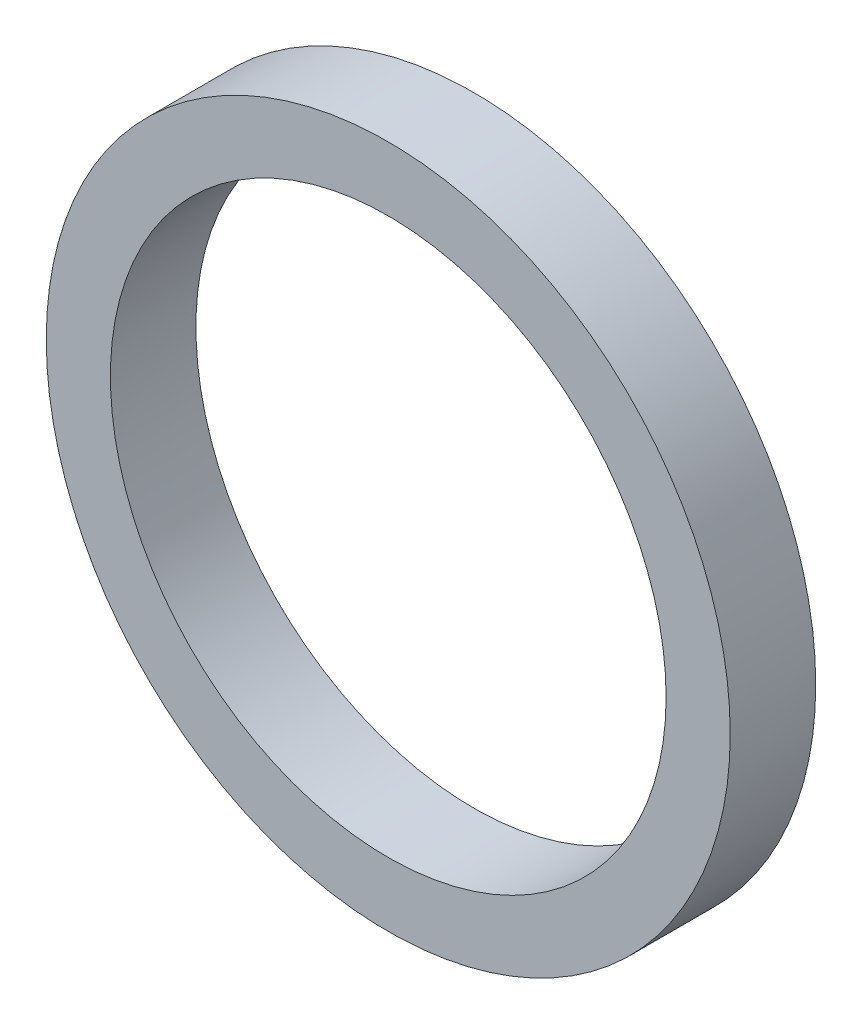
ISO-10303-21;
HEADER;
FILE_DESCRIPTION(('STEP AP214'),'2;1');
FILE_NAME('part.step','',(''),(''),'','','');
FILE_SCHEMA(('AUTOMOTIVE_DESIGN { 1 0 10303 214 1 1 1 1 }'));
ENDSEC;
DATA;
#1=APPLICATION_CONTEXT('core data for automotive mechanical design processes');
#2=APPLICATION_PROTOCOL_DEFINITION('international standard','automotive_design',2000,#1);
#3=PRODUCT_CONTEXT('',#1,'mechanical');
#4=PRODUCT('Part','Part','',(#3));
#5=PRODUCT_RELATED_PRODUCT_CATEGORY('part','',(#4));
#6=PRODUCT_DEFINITION_FORMATION('','',#4);
#7=PRODUCT_DEFINITION_CONTEXT('part definition',#1,'design');
#8=PRODUCT_DEFINITION('design','',#6,#7);
#9=PRODUCT_DEFINITION_SHAPE('','',#8);
#10=(LENGTH_UNIT() NAMED_UNIT(*) SI_UNIT(.MILLI.,.METRE.));
#11=(NAMED_UNIT(*) PLANE_ANGLE_UNIT() SI_UNIT($,.RADIAN.));
#12=(NAMED_UNIT(*) SI_UNIT($,.STERADIAN.) SOLID_ANGLE_UNIT());
#13=UNCERTAINTY_MEASURE_WITH_UNIT(LENGTH_MEASURE(1.E-05),#10,'distance_accuracy_value','');
#14=(GEOMETRIC_REPRESENTATION_CONTEXT(3) GLOBAL_UNCERTAINTY_ASSIGNED_CONTEXT((#13)) GLOBAL_UNIT_ASSIGNED_CONTEXT((#10,
#11,#12)) REPRESENTATION_CONTEXT('',''));
#15=CARTESIAN_POINT('',(0.,0.,0.));
#16=DIRECTION('',(0.,0.,1.));
#17=DIRECTION('',(1.,0.,0.));
#18=AXIS2_PLACEMENT_3D('',#15,#16,#17);
#19=CARTESIAN_POINT('',(0.,0.,10.));
#20=DIRECTION('',(0.,0.,1.));
#21=DIRECTION('',(1.,0.,0.));
#22=AXIS2_PLACEMENT_3D('',#19,#20,#21);
#23=PLANE('',#22);
#24=CARTESIAN_POINT('',(0.,0.,10.));
#25=DIRECTION('',(0.,0.,1.));
#26=DIRECTION('',(1.,0.,0.));
#27=AXIS2_PLACEMENT_3D('',#24,#25,#26);
#28=CIRCLE('',#27,40.);
#29=CARTESIAN_POINT('',(40.,0.,10.));
#30=VERTEX_POINT('',#29);
#31=EDGE_CURVE('E10',#30,#30,#28,.T.);
#32=ORIENTED_EDGE('',*,*,#31,.T.);
#33=EDGE_LOOP('',(#32));
#34=FACE_BOUND('',#33,.T.);
#35=CARTESIAN_POINT('',(0.,0.,10.));
#36=DIRECTION('',(0.,0.,1.));
#37=DIRECTION('',(1.,0.,0.));
#38=AXIS2_PLACEMENT_3D('',#35,#36,#37);
#39=CIRCLE('',#38,32.5);
#40=CARTESIAN_POINT('',(32.5,0.,10.));
#41=VERTEX_POINT('',#40);
#42=EDGE_CURVE('E47',#41,#41,#39,.T.);
#43=ORIENTED_EDGE('',*,*,#42,.F.);
#44=EDGE_LOOP('',(#43));
#45=FACE_BOUND('',#44,.T.);
#46=ADVANCED_FACE('F36',(#34,#45),#23,.T.);
#47=CARTESIAN_POINT('',(0.,0.,0.));
#48=DIRECTION('',(0.,0.,1.));
#49=DIRECTION('',(1.,0.,0.));
#50=AXIS2_PLACEMENT_3D('',#47,#48,#49);
#51=PLANE('',#50);
#52=CARTESIAN_POINT('',(0.,0.,0.));
#53=DIRECTION('',(0.,0.,1.));
#54=DIRECTION('',(1.,0.,0.));
#55=AXIS2_PLACEMENT_3D('',#52,#53,#54);
#56=CIRCLE('',#55,40.);
#57=CARTESIAN_POINT('',(40.,0.,0.));
#58=VERTEX_POINT('',#57);
#59=EDGE_CURVE('E40',#58,#58,#56,.T.);
#60=ORIENTED_EDGE('',*,*,#59,.F.);
#61=EDGE_LOOP('',(#60));
#62=FACE_BOUND('',#61,.T.);
#63=CARTESIAN_POINT('',(0.,0.,0.));
#64=DIRECTION('',(0.,0.,1.));
#65=DIRECTION('',(1.,0.,0.));
#66=AXIS2_PLACEMENT_3D('',#63,#64,#65);
#67=CIRCLE('',#66,32.5);
#68=CARTESIAN_POINT('',(32.5,0.,0.));
#69=VERTEX_POINT('',#68);
#70=EDGE_CURVE('E49',#69,#69,#67,.T.);
#71=ORIENTED_EDGE('',*,*,#70,.T.);
#72=EDGE_LOOP('',(#71));
#73=FACE_BOUND('',#72,.T.);
#74=ADVANCED_FACE('F59',(#62,#73),#51,.F.);
#75=CARTESIAN_POINT('',(0.,0.,10.));
#76=DIRECTION('',(0.,0.,-1.));
#77=DIRECTION('',(-1.,0.,0.));
#78=AXIS2_PLACEMENT_3D('',#75,#76,#77);
#79=CYLINDRICAL_SURFACE('',#78,40.);
#80=ORIENTED_EDGE('',*,*,#31,.F.);
#81=EDGE_LOOP('',(#80));
#82=FACE_BOUND('',#81,.T.);
#83=ORIENTED_EDGE('',*,*,#59,.T.);
#84=EDGE_LOOP('',(#83));
#85=FACE_BOUND('',#84,.T.);
#86=ADVANCED_FACE('F38',(#82,#85),#79,.T.);
#87=CARTESIAN_POINT('',(0.,0.,10.));
#88=DIRECTION('',(0.,0.,-1.));
#89=DIRECTION('',(-1.,0.,0.));
#90=AXIS2_PLACEMENT_3D('',#87,#88,#89);
#91=CYLINDRICAL_SURFACE('',#90,32.5);
#92=ORIENTED_EDGE('',*,*,#42,.T.);
#93=EDGE_LOOP('',(#92));
#94=FACE_BOUND('',#93,.T.);
#95=ORIENTED_EDGE('',*,*,#70,.F.);
#96=EDGE_LOOP('',(#95));
#97=FACE_BOUND('',#96,.T.);
#98=ADVANCED_FACE('F55',(#94,#97),#91,.F.);
#99=CLOSED_SHELL('',(#46,#74,#86,#98));
#100=MANIFOLD_SOLID_BREP('B2',#99);
#101=ADVANCED_BREP_SHAPE_REPRESENTATION('',(#18,#100),#14);
#102=SHAPE_DEFINITION_REPRESENTATION(#9,#101);
ENDSEC;
END-ISO-10303-21;
